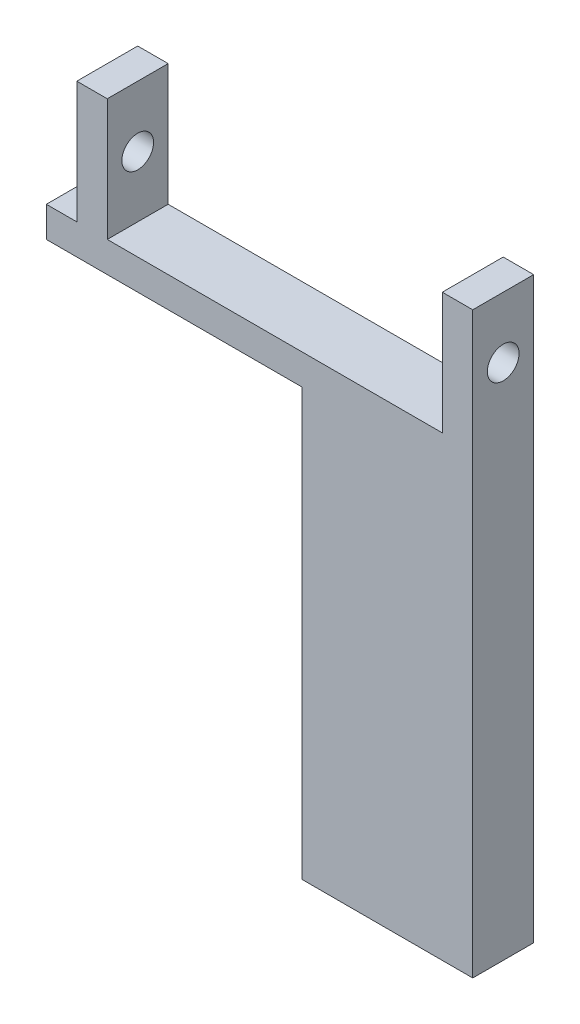
ISO-10303-21;
HEADER;
FILE_DESCRIPTION(('STEP AP214'),'2;1');
FILE_NAME('part.step','',(''),(''),'','','');
FILE_SCHEMA(('AUTOMOTIVE_DESIGN { 1 0 10303 214 1 1 1 1 }'));
ENDSEC;
DATA;
#1=APPLICATION_CONTEXT('core data for automotive mechanical design processes');
#2=APPLICATION_PROTOCOL_DEFINITION('international standard','automotive_design',2000,#1);
#3=PRODUCT_CONTEXT('',#1,'mechanical');
#4=PRODUCT('Part','Part','',(#3));
#5=PRODUCT_RELATED_PRODUCT_CATEGORY('part','',(#4));
#6=PRODUCT_DEFINITION_FORMATION('','',#4);
#7=PRODUCT_DEFINITION_CONTEXT('part definition',#1,'design');
#8=PRODUCT_DEFINITION('design','',#6,#7);
#9=PRODUCT_DEFINITION_SHAPE('','',#8);
#10=(LENGTH_UNIT() NAMED_UNIT(*) SI_UNIT(.MILLI.,.METRE.));
#11=(NAMED_UNIT(*) PLANE_ANGLE_UNIT() SI_UNIT($,.RADIAN.));
#12=(NAMED_UNIT(*) SI_UNIT($,.STERADIAN.) SOLID_ANGLE_UNIT());
#13=UNCERTAINTY_MEASURE_WITH_UNIT(LENGTH_MEASURE(1.E-05),#10,'distance_accuracy_value','');
#14=(GEOMETRIC_REPRESENTATION_CONTEXT(3) GLOBAL_UNCERTAINTY_ASSIGNED_CONTEXT((#13)) GLOBAL_UNIT_ASSIGNED_CONTEXT((#10,
#11,#12)) REPRESENTATION_CONTEXT('',''));
#15=CARTESIAN_POINT('',(0.,0.,0.));
#16=DIRECTION('',(0.,0.,1.));
#17=DIRECTION('',(1.,0.,0.));
#18=AXIS2_PLACEMENT_3D('',#15,#16,#17);
#19=CARTESIAN_POINT('',(-70.,75.,10.));
#20=DIRECTION('',(1.,0.,0.));
#21=DIRECTION('',(0.,0.,-1.));
#22=AXIS2_PLACEMENT_3D('',#19,#20,#21);
#23=PLANE('',#22);
#24=DIRECTION('',(0.,-1.,0.));
#25=VECTOR('',#24,1.);
#26=CARTESIAN_POINT('',(-70.,75.,0.));
#27=LINE('',#26,#25);
#28=CARTESIAN_POINT('',(-70.,75.,0.));
#29=VERTEX_POINT('',#28);
#30=CARTESIAN_POINT('',(-70.,70.,0.));
#31=VERTEX_POINT('',#30);
#32=EDGE_CURVE('E155',#29,#31,#27,.T.);
#33=ORIENTED_EDGE('',*,*,#32,.T.);
#34=DIRECTION('',(0.,0.,-1.));
#35=VECTOR('',#34,1.);
#36=CARTESIAN_POINT('',(-70.,70.,10.));
#37=LINE('',#36,#35);
#38=CARTESIAN_POINT('',(-70.,70.,10.));
#39=VERTEX_POINT('',#38);
#40=EDGE_CURVE('E11',#39,#31,#37,.T.);
#41=ORIENTED_EDGE('',*,*,#40,.F.);
#42=DIRECTION('',(0.,-1.,0.));
#43=VECTOR('',#42,1.);
#44=CARTESIAN_POINT('',(-70.,75.,10.));
#45=LINE('',#44,#43);
#46=CARTESIAN_POINT('',(-70.,75.,10.));
#47=VERTEX_POINT('',#46);
#48=EDGE_CURVE('E179',#47,#39,#45,.T.);
#49=ORIENTED_EDGE('',*,*,#48,.F.);
#50=DIRECTION('',(0.,0.,-1.));
#51=VECTOR('',#50,1.);
#52=CARTESIAN_POINT('',(-70.,75.,10.));
#53=LINE('',#52,#51);
#54=EDGE_CURVE('E151',#47,#29,#53,.T.);
#55=ORIENTED_EDGE('',*,*,#54,.T.);
#56=EDGE_LOOP('',(#33,#41,#49,#55));
#57=FACE_BOUND('',#56,.T.);
#58=ADVANCED_FACE('F35',(#57),#23,.F.);
#59=CARTESIAN_POINT('',(-70.,70.,10.));
#60=DIRECTION('',(0.,1.,0.));
#61=DIRECTION('',(0.,0.,1.));
#62=AXIS2_PLACEMENT_3D('',#59,#60,#61);
#63=PLANE('',#62);
#64=DIRECTION('',(1.,0.,0.));
#65=VECTOR('',#64,1.);
#66=CARTESIAN_POINT('',(-70.,70.,0.));
#67=LINE('',#66,#65);
#68=CARTESIAN_POINT('',(-28.,70.,0.));
#69=VERTEX_POINT('',#68);
#70=EDGE_CURVE('E158',#31,#69,#67,.T.);
#71=ORIENTED_EDGE('',*,*,#70,.T.);
#72=DIRECTION('',(0.,0.,-1.));
#73=VECTOR('',#72,1.);
#74=CARTESIAN_POINT('',(-28.,70.,10.));
#75=LINE('',#74,#73);
#76=CARTESIAN_POINT('',(-28.,70.,10.));
#77=VERTEX_POINT('',#76);
#78=EDGE_CURVE('E43',#77,#69,#75,.T.);
#79=ORIENTED_EDGE('',*,*,#78,.F.);
#80=DIRECTION('',(1.,0.,0.));
#81=VECTOR('',#80,1.);
#82=CARTESIAN_POINT('',(-70.,70.,10.));
#83=LINE('',#82,#81);
#84=EDGE_CURVE('E106',#39,#77,#83,.T.);
#85=ORIENTED_EDGE('',*,*,#84,.F.);
#86=ORIENTED_EDGE('',*,*,#40,.T.);
#87=EDGE_LOOP('',(#71,#79,#85,#86));
#88=FACE_BOUND('',#87,.T.);
#89=ADVANCED_FACE('F257',(#88),#63,.F.);
#90=CARTESIAN_POINT('',(-28.,70.,10.));
#91=DIRECTION('',(1.,0.,0.));
#92=DIRECTION('',(0.,1.,0.));
#93=AXIS2_PLACEMENT_3D('',#90,#91,#92);
#94=PLANE('',#93);
#95=DIRECTION('',(0.,-1.,0.));
#96=VECTOR('',#95,1.);
#97=CARTESIAN_POINT('',(-28.,70.,0.));
#98=LINE('',#97,#96);
#99=CARTESIAN_POINT('',(-28.,0.,0.));
#100=VERTEX_POINT('',#99);
#101=EDGE_CURVE('E161',#69,#100,#98,.T.);
#102=ORIENTED_EDGE('',*,*,#101,.T.);
#103=DIRECTION('',(0.,0.,-1.));
#104=VECTOR('',#103,1.);
#105=CARTESIAN_POINT('',(-28.,0.,10.));
#106=LINE('',#105,#104);
#107=CARTESIAN_POINT('',(-28.,0.,10.));
#108=VERTEX_POINT('',#107);
#109=EDGE_CURVE('E198',#108,#100,#106,.T.);
#110=ORIENTED_EDGE('',*,*,#109,.F.);
#111=DIRECTION('',(0.,-1.,0.));
#112=VECTOR('',#111,1.);
#113=CARTESIAN_POINT('',(-28.,70.,10.));
#114=LINE('',#113,#112);
#115=EDGE_CURVE('E206',#77,#108,#114,.T.);
#116=ORIENTED_EDGE('',*,*,#115,.F.);
#117=ORIENTED_EDGE('',*,*,#78,.T.);
#118=EDGE_LOOP('',(#102,#110,#116,#117));
#119=FACE_BOUND('',#118,.T.);
#120=ADVANCED_FACE('F204',(#119),#94,.F.);
#121=CARTESIAN_POINT('',(-28.,0.,10.));
#122=DIRECTION('',(0.,1.,0.));
#123=DIRECTION('',(0.,0.,1.));
#124=AXIS2_PLACEMENT_3D('',#121,#122,#123);
#125=PLANE('',#124);
#126=DIRECTION('',(1.,0.,0.));
#127=VECTOR('',#126,1.);
#128=CARTESIAN_POINT('',(-28.,0.,0.));
#129=LINE('',#128,#127);
#130=CARTESIAN_POINT('',(0.,0.,0.));
#131=VERTEX_POINT('',#130);
#132=EDGE_CURVE('E163',#100,#131,#129,.T.);
#133=ORIENTED_EDGE('',*,*,#132,.T.);
#134=DIRECTION('',(0.,0.,-1.));
#135=VECTOR('',#134,1.);
#136=CARTESIAN_POINT('',(0.,0.,10.));
#137=LINE('',#136,#135);
#138=CARTESIAN_POINT('',(0.,0.,10.));
#139=VERTEX_POINT('',#138);
#140=EDGE_CURVE('E195',#139,#131,#137,.T.);
#141=ORIENTED_EDGE('',*,*,#140,.F.);
#142=DIRECTION('',(1.,0.,0.));
#143=VECTOR('',#142,1.);
#144=CARTESIAN_POINT('',(-28.,0.,10.));
#145=LINE('',#144,#143);
#146=EDGE_CURVE('E223',#108,#139,#145,.T.);
#147=ORIENTED_EDGE('',*,*,#146,.F.);
#148=ORIENTED_EDGE('',*,*,#109,.T.);
#149=EDGE_LOOP('',(#133,#141,#147,#148));
#150=FACE_BOUND('',#149,.T.);
#151=ADVANCED_FACE('F214',(#150),#125,.F.);
#152=CARTESIAN_POINT('',(0.,75.,10.));
#153=DIRECTION('',(-1.,0.,0.));
#154=DIRECTION('',(0.,0.,1.));
#155=AXIS2_PLACEMENT_3D('',#152,#153,#154);
#156=PLANE('',#155);
#157=CARTESIAN_POINT('',(0.,85.,5.));
#158=DIRECTION('',(-1.,0.,0.));
#159=DIRECTION('',(0.,0.,1.));
#160=AXIS2_PLACEMENT_3D('',#157,#158,#159);
#161=CIRCLE('',#160,2.60000000000001);
#162=CARTESIAN_POINT('',(0.,85.,7.60000000000001));
#163=VERTEX_POINT('',#162);
#164=EDGE_CURVE('E392',#163,#163,#161,.T.);
#165=ORIENTED_EDGE('',*,*,#164,.T.);
#166=EDGE_LOOP('',(#165));
#167=FACE_BOUND('',#166,.T.);
#168=DIRECTION('',(0.,1.,0.));
#169=VECTOR('',#168,1.);
#170=CARTESIAN_POINT('',(0.,75.,0.));
#171=LINE('',#170,#169);
#172=CARTESIAN_POINT('',(0.,95.,0.));
#173=VERTEX_POINT('',#172);
#174=EDGE_CURVE('E166',#131,#173,#171,.T.);
#175=ORIENTED_EDGE('',*,*,#174,.T.);
#176=DIRECTION('',(0.,0.,-1.));
#177=VECTOR('',#176,1.);
#178=CARTESIAN_POINT('',(0.,95.,10.));
#179=LINE('',#178,#177);
#180=CARTESIAN_POINT('',(0.,95.,10.));
#181=VERTEX_POINT('',#180);
#182=EDGE_CURVE('E192',#181,#173,#179,.T.);
#183=ORIENTED_EDGE('',*,*,#182,.F.);
#184=DIRECTION('',(0.,1.,0.));
#185=VECTOR('',#184,1.);
#186=CARTESIAN_POINT('',(0.,70.,10.));
#187=LINE('',#186,#185);
#188=EDGE_CURVE('E220',#139,#181,#187,.T.);
#189=ORIENTED_EDGE('',*,*,#188,.F.);
#190=ORIENTED_EDGE('',*,*,#140,.T.);
#191=EDGE_LOOP('',(#175,#183,#189,#190));
#192=FACE_BOUND('',#191,.T.);
#193=ADVANCED_FACE('F218',(#167,#192),#156,.F.);
#194=CARTESIAN_POINT('',(-5.,95.,10.));
#195=DIRECTION('',(0.,-1.,0.));
#196=DIRECTION('',(0.,0.,-1.));
#197=AXIS2_PLACEMENT_3D('',#194,#195,#196);
#198=PLANE('',#197);
#199=DIRECTION('',(-1.,0.,0.));
#200=VECTOR('',#199,1.);
#201=CARTESIAN_POINT('',(-5.,95.,0.));
#202=LINE('',#201,#200);
#203=CARTESIAN_POINT('',(-5.,95.,0.));
#204=VERTEX_POINT('',#203);
#205=EDGE_CURVE('E168',#173,#204,#202,.T.);
#206=ORIENTED_EDGE('',*,*,#205,.T.);
#207=DIRECTION('',(0.,0.,-1.));
#208=VECTOR('',#207,1.);
#209=CARTESIAN_POINT('',(-5.,95.,10.));
#210=LINE('',#209,#208);
#211=CARTESIAN_POINT('',(-5.,95.,10.));
#212=VERTEX_POINT('',#211);
#213=EDGE_CURVE('E189',#212,#204,#210,.T.);
#214=ORIENTED_EDGE('',*,*,#213,.F.);
#215=DIRECTION('',(-1.,0.,0.));
#216=VECTOR('',#215,1.);
#217=CARTESIAN_POINT('',(-5.,95.,10.));
#218=LINE('',#217,#216);
#219=EDGE_CURVE('E222',#181,#212,#218,.T.);
#220=ORIENTED_EDGE('',*,*,#219,.F.);
#221=ORIENTED_EDGE('',*,*,#182,.T.);
#222=EDGE_LOOP('',(#206,#214,#220,#221));
#223=FACE_BOUND('',#222,.T.);
#224=ADVANCED_FACE('F270',(#223),#198,.F.);
#225=CARTESIAN_POINT('',(-5.,75.,10.));
#226=DIRECTION('',(1.,0.,0.));
#227=DIRECTION('',(0.,1.,0.));
#228=AXIS2_PLACEMENT_3D('',#225,#226,#227);
#229=PLANE('',#228);
#230=CARTESIAN_POINT('',(-5.,85.,5.));
#231=DIRECTION('',(1.,0.,0.));
#232=DIRECTION('',(0.,1.,0.));
#233=AXIS2_PLACEMENT_3D('',#230,#231,#232);
#234=CIRCLE('',#233,2.60000000000001);
#235=CARTESIAN_POINT('',(-5.,87.6,5.));
#236=VERTEX_POINT('',#235);
#237=EDGE_CURVE('E159',#236,#236,#234,.T.);
#238=ORIENTED_EDGE('',*,*,#237,.T.);
#239=EDGE_LOOP('',(#238));
#240=FACE_BOUND('',#239,.T.);
#241=DIRECTION('',(0.,-1.,0.));
#242=VECTOR('',#241,1.);
#243=CARTESIAN_POINT('',(-5.,75.,0.));
#244=LINE('',#243,#242);
#245=CARTESIAN_POINT('',(-5.,75.,0.));
#246=VERTEX_POINT('',#245);
#247=EDGE_CURVE('E170',#204,#246,#244,.T.);
#248=ORIENTED_EDGE('',*,*,#247,.T.);
#249=DIRECTION('',(0.,0.,-1.));
#250=VECTOR('',#249,1.);
#251=CARTESIAN_POINT('',(-5.,75.,10.));
#252=LINE('',#251,#250);
#253=CARTESIAN_POINT('',(-5.,75.,10.));
#254=VERTEX_POINT('',#253);
#255=EDGE_CURVE('E186',#254,#246,#252,.T.);
#256=ORIENTED_EDGE('',*,*,#255,.F.);
#257=DIRECTION('',(0.,-1.,0.));
#258=VECTOR('',#257,1.);
#259=CARTESIAN_POINT('',(-5.,75.,10.));
#260=LINE('',#259,#258);
#261=EDGE_CURVE('E225',#212,#254,#260,.T.);
#262=ORIENTED_EDGE('',*,*,#261,.F.);
#263=ORIENTED_EDGE('',*,*,#213,.T.);
#264=EDGE_LOOP('',(#248,#256,#262,#263));
#265=FACE_BOUND('',#264,.T.);
#266=ADVANCED_FACE('F274',(#240,#265),#229,.F.);
#267=CARTESIAN_POINT('',(-60.,75.,10.));
#268=DIRECTION('',(0.,-1.,0.));
#269=DIRECTION('',(0.,0.,-1.));
#270=AXIS2_PLACEMENT_3D('',#267,#268,#269);
#271=PLANE('',#270);
#272=DIRECTION('',(-1.,0.,0.));
#273=VECTOR('',#272,1.);
#274=CARTESIAN_POINT('',(-60.,75.,0.));
#275=LINE('',#274,#273);
#276=CARTESIAN_POINT('',(-60.,75.,0.));
#277=VERTEX_POINT('',#276);
#278=EDGE_CURVE('E172',#246,#277,#275,.T.);
#279=ORIENTED_EDGE('',*,*,#278,.T.);
#280=DIRECTION('',(0.,0.,-1.));
#281=VECTOR('',#280,1.);
#282=CARTESIAN_POINT('',(-60.,75.,10.));
#283=LINE('',#282,#281);
#284=CARTESIAN_POINT('',(-60.,75.,10.));
#285=VERTEX_POINT('',#284);
#286=EDGE_CURVE('E183',#285,#277,#283,.T.);
#287=ORIENTED_EDGE('',*,*,#286,.F.);
#288=DIRECTION('',(-1.,0.,0.));
#289=VECTOR('',#288,1.);
#290=CARTESIAN_POINT('',(-60.,75.,10.));
#291=LINE('',#290,#289);
#292=EDGE_CURVE('E231',#254,#285,#291,.T.);
#293=ORIENTED_EDGE('',*,*,#292,.F.);
#294=ORIENTED_EDGE('',*,*,#255,.T.);
#295=EDGE_LOOP('',(#279,#287,#293,#294));
#296=FACE_BOUND('',#295,.T.);
#297=ADVANCED_FACE('F237',(#296),#271,.F.);
#298=CARTESIAN_POINT('',(-60.,75.,10.));
#299=DIRECTION('',(-1.,0.,0.));
#300=DIRECTION('',(0.,0.,1.));
#301=AXIS2_PLACEMENT_3D('',#298,#299,#300);
#302=PLANE('',#301);
#303=CARTESIAN_POINT('',(-60.,85.,5.));
#304=DIRECTION('',(-1.,0.,0.));
#305=DIRECTION('',(0.,0.,1.));
#306=AXIS2_PLACEMENT_3D('',#303,#304,#305);
#307=CIRCLE('',#306,2.60000000000001);
#308=CARTESIAN_POINT('',(-60.,85.,7.60000000000001));
#309=VERTEX_POINT('',#308);
#310=EDGE_CURVE('E395',#309,#309,#307,.T.);
#311=ORIENTED_EDGE('',*,*,#310,.T.);
#312=EDGE_LOOP('',(#311));
#313=FACE_BOUND('',#312,.T.);
#314=DIRECTION('',(0.,1.,0.));
#315=VECTOR('',#314,1.);
#316=CARTESIAN_POINT('',(-60.,75.,0.));
#317=LINE('',#316,#315);
#318=CARTESIAN_POINT('',(-60.,95.,0.));
#319=VERTEX_POINT('',#318);
#320=EDGE_CURVE('E174',#277,#319,#317,.T.);
#321=ORIENTED_EDGE('',*,*,#320,.T.);
#322=DIRECTION('',(0.,0.,-1.));
#323=VECTOR('',#322,1.);
#324=CARTESIAN_POINT('',(-60.,95.,10.));
#325=LINE('',#324,#323);
#326=CARTESIAN_POINT('',(-60.,95.,10.));
#327=VERTEX_POINT('',#326);
#328=EDGE_CURVE('E146',#327,#319,#325,.T.);
#329=ORIENTED_EDGE('',*,*,#328,.F.);
#330=DIRECTION('',(0.,1.,0.));
#331=VECTOR('',#330,1.);
#332=CARTESIAN_POINT('',(-60.,75.,10.));
#333=LINE('',#332,#331);
#334=EDGE_CURVE('E137',#285,#327,#333,.T.);
#335=ORIENTED_EDGE('',*,*,#334,.F.);
#336=ORIENTED_EDGE('',*,*,#286,.T.);
#337=EDGE_LOOP('',(#321,#329,#335,#336));
#338=FACE_BOUND('',#337,.T.);
#339=ADVANCED_FACE('F241',(#313,#338),#302,.F.);
#340=CARTESIAN_POINT('',(-65.,95.,10.));
#341=DIRECTION('',(0.,-1.,0.));
#342=DIRECTION('',(0.,0.,-1.));
#343=AXIS2_PLACEMENT_3D('',#340,#341,#342);
#344=PLANE('',#343);
#345=DIRECTION('',(-1.,0.,0.));
#346=VECTOR('',#345,1.);
#347=CARTESIAN_POINT('',(-65.,95.,0.));
#348=LINE('',#347,#346);
#349=CARTESIAN_POINT('',(-65.,95.,0.));
#350=VERTEX_POINT('',#349);
#351=EDGE_CURVE('E145',#319,#350,#348,.T.);
#352=ORIENTED_EDGE('',*,*,#351,.T.);
#353=DIRECTION('',(0.,0.,-1.));
#354=VECTOR('',#353,1.);
#355=CARTESIAN_POINT('',(-65.,95.,10.));
#356=LINE('',#355,#354);
#357=CARTESIAN_POINT('',(-65.,95.,10.));
#358=VERTEX_POINT('',#357);
#359=EDGE_CURVE('E142',#358,#350,#356,.T.);
#360=ORIENTED_EDGE('',*,*,#359,.F.);
#361=DIRECTION('',(-1.,0.,0.));
#362=VECTOR('',#361,1.);
#363=CARTESIAN_POINT('',(-65.,95.,10.));
#364=LINE('',#363,#362);
#365=EDGE_CURVE('E131',#327,#358,#364,.T.);
#366=ORIENTED_EDGE('',*,*,#365,.F.);
#367=ORIENTED_EDGE('',*,*,#328,.T.);
#368=EDGE_LOOP('',(#352,#360,#366,#367));
#369=FACE_BOUND('',#368,.T.);
#370=ADVANCED_FACE('F143',(#369),#344,.F.);
#371=CARTESIAN_POINT('',(-65.,75.,10.));
#372=DIRECTION('',(1.,0.,0.));
#373=DIRECTION('',(0.,0.,-1.));
#374=AXIS2_PLACEMENT_3D('',#371,#372,#373);
#375=PLANE('',#374);
#376=CARTESIAN_POINT('',(-65.,85.,5.));
#377=DIRECTION('',(-1.,0.,0.));
#378=DIRECTION('',(0.,0.,1.));
#379=AXIS2_PLACEMENT_3D('',#376,#377,#378);
#380=CIRCLE('',#379,2.60000000000001);
#381=CARTESIAN_POINT('',(-65.,85.,7.60000000000001));
#382=VERTEX_POINT('',#381);
#383=EDGE_CURVE('E402',#382,#382,#380,.T.);
#384=ORIENTED_EDGE('',*,*,#383,.F.);
#385=EDGE_LOOP('',(#384));
#386=FACE_BOUND('',#385,.T.);
#387=DIRECTION('',(0.,-1.,0.));
#388=VECTOR('',#387,1.);
#389=CARTESIAN_POINT('',(-65.,75.,0.));
#390=LINE('',#389,#388);
#391=CARTESIAN_POINT('',(-65.,75.,0.));
#392=VERTEX_POINT('',#391);
#393=EDGE_CURVE('E92',#350,#392,#390,.T.);
#394=ORIENTED_EDGE('',*,*,#393,.T.);
#395=DIRECTION('',(0.,0.,-1.));
#396=VECTOR('',#395,1.);
#397=CARTESIAN_POINT('',(-65.,75.,10.));
#398=LINE('',#397,#396);
#399=CARTESIAN_POINT('',(-65.,75.,10.));
#400=VERTEX_POINT('',#399);
#401=EDGE_CURVE('E147',#400,#392,#398,.T.);
#402=ORIENTED_EDGE('',*,*,#401,.F.);
#403=DIRECTION('',(0.,-1.,0.));
#404=VECTOR('',#403,1.);
#405=CARTESIAN_POINT('',(-65.,75.,10.));
#406=LINE('',#405,#404);
#407=EDGE_CURVE('E135',#358,#400,#406,.T.);
#408=ORIENTED_EDGE('',*,*,#407,.F.);
#409=ORIENTED_EDGE('',*,*,#359,.T.);
#410=EDGE_LOOP('',(#394,#402,#408,#409));
#411=FACE_BOUND('',#410,.T.);
#412=ADVANCED_FACE('F149',(#386,#411),#375,.F.);
#413=CARTESIAN_POINT('',(-70.,75.,10.));
#414=DIRECTION('',(0.,-1.,0.));
#415=DIRECTION('',(0.,0.,-1.));
#416=AXIS2_PLACEMENT_3D('',#413,#414,#415);
#417=PLANE('',#416);
#418=DIRECTION('',(-1.,0.,0.));
#419=VECTOR('',#418,1.);
#420=CARTESIAN_POINT('',(-70.,75.,0.));
#421=LINE('',#420,#419);
#422=EDGE_CURVE('E98',#392,#29,#421,.T.);
#423=ORIENTED_EDGE('',*,*,#422,.T.);
#424=ORIENTED_EDGE('',*,*,#54,.F.);
#425=DIRECTION('',(-1.,0.,0.));
#426=VECTOR('',#425,1.);
#427=CARTESIAN_POINT('',(-70.,75.,10.));
#428=LINE('',#427,#426);
#429=EDGE_CURVE('E51',#400,#47,#428,.T.);
#430=ORIENTED_EDGE('',*,*,#429,.F.);
#431=ORIENTED_EDGE('',*,*,#401,.T.);
#432=EDGE_LOOP('',(#423,#424,#430,#431));
#433=FACE_BOUND('',#432,.T.);
#434=ADVANCED_FACE('F245',(#433),#417,.F.);
#435=CARTESIAN_POINT('',(0.,0.,10.));
#436=DIRECTION('',(0.,0.,1.));
#437=DIRECTION('',(1.,0.,0.));
#438=AXIS2_PLACEMENT_3D('',#435,#436,#437);
#439=PLANE('',#438);
#440=ORIENTED_EDGE('',*,*,#48,.T.);
#441=ORIENTED_EDGE('',*,*,#84,.T.);
#442=ORIENTED_EDGE('',*,*,#115,.T.);
#443=ORIENTED_EDGE('',*,*,#146,.T.);
#444=ORIENTED_EDGE('',*,*,#188,.T.);
#445=ORIENTED_EDGE('',*,*,#219,.T.);
#446=ORIENTED_EDGE('',*,*,#261,.T.);
#447=ORIENTED_EDGE('',*,*,#292,.T.);
#448=ORIENTED_EDGE('',*,*,#334,.T.);
#449=ORIENTED_EDGE('',*,*,#365,.T.);
#450=ORIENTED_EDGE('',*,*,#407,.T.);
#451=ORIENTED_EDGE('',*,*,#429,.T.);
#452=EDGE_LOOP('',(#440,#441,#442,#443,#444,#445,#446,#447,#448,#449,#450,#451));
#453=FACE_BOUND('',#452,.T.);
#454=ADVANCED_FACE('F133',(#453),#439,.T.);
#455=CARTESIAN_POINT('',(0.,0.,0.));
#456=DIRECTION('',(0.,0.,1.));
#457=DIRECTION('',(1.,0.,0.));
#458=AXIS2_PLACEMENT_3D('',#455,#456,#457);
#459=PLANE('',#458);
#460=ORIENTED_EDGE('',*,*,#32,.F.);
#461=ORIENTED_EDGE('',*,*,#422,.F.);
#462=ORIENTED_EDGE('',*,*,#393,.F.);
#463=ORIENTED_EDGE('',*,*,#351,.F.);
#464=ORIENTED_EDGE('',*,*,#320,.F.);
#465=ORIENTED_EDGE('',*,*,#278,.F.);
#466=ORIENTED_EDGE('',*,*,#247,.F.);
#467=ORIENTED_EDGE('',*,*,#205,.F.);
#468=ORIENTED_EDGE('',*,*,#174,.F.);
#469=ORIENTED_EDGE('',*,*,#132,.F.);
#470=ORIENTED_EDGE('',*,*,#101,.F.);
#471=ORIENTED_EDGE('',*,*,#70,.F.);
#472=EDGE_LOOP('',(#460,#461,#462,#463,#464,#465,#466,#467,#468,#469,#470,#471));
#473=FACE_BOUND('',#472,.T.);
#474=ADVANCED_FACE('F210',(#473),#459,.F.);
#475=CARTESIAN_POINT('',(0.,85.,5.));
#476=DIRECTION('',(-1.,0.,0.));
#477=DIRECTION('',(0.,0.,1.));
#478=AXIS2_PLACEMENT_3D('',#475,#476,#477);
#479=CYLINDRICAL_SURFACE('',#478,2.60000000000001);
#480=ORIENTED_EDGE('',*,*,#383,.T.);
#481=EDGE_LOOP('',(#480));
#482=FACE_BOUND('',#481,.T.);
#483=ORIENTED_EDGE('',*,*,#310,.F.);
#484=EDGE_LOOP('',(#483));
#485=FACE_BOUND('',#484,.T.);
#486=ADVANCED_FACE('F303',(#482,#485),#479,.F.);
#487=ORIENTED_EDGE('',*,*,#164,.F.);
#488=EDGE_LOOP('',(#487));
#489=FACE_BOUND('',#488,.T.);
#490=ORIENTED_EDGE('',*,*,#237,.F.);
#491=EDGE_LOOP('',(#490));
#492=FACE_BOUND('',#491,.T.);
#493=ADVANCED_FACE('F308',(#489,#492),#479,.F.);
#494=CLOSED_SHELL('',(#58,#89,#120,#151,#193,#224,#266,#297,#339,#370,#412,#434,#454,#474,#486,#493));
#495=MANIFOLD_SOLID_BREP('B2',#494);
#496=ADVANCED_BREP_SHAPE_REPRESENTATION('',(#18,#495),#14);
#497=SHAPE_DEFINITION_REPRESENTATION(#9,#496);
ENDSEC;
END-ISO-10303-21;
